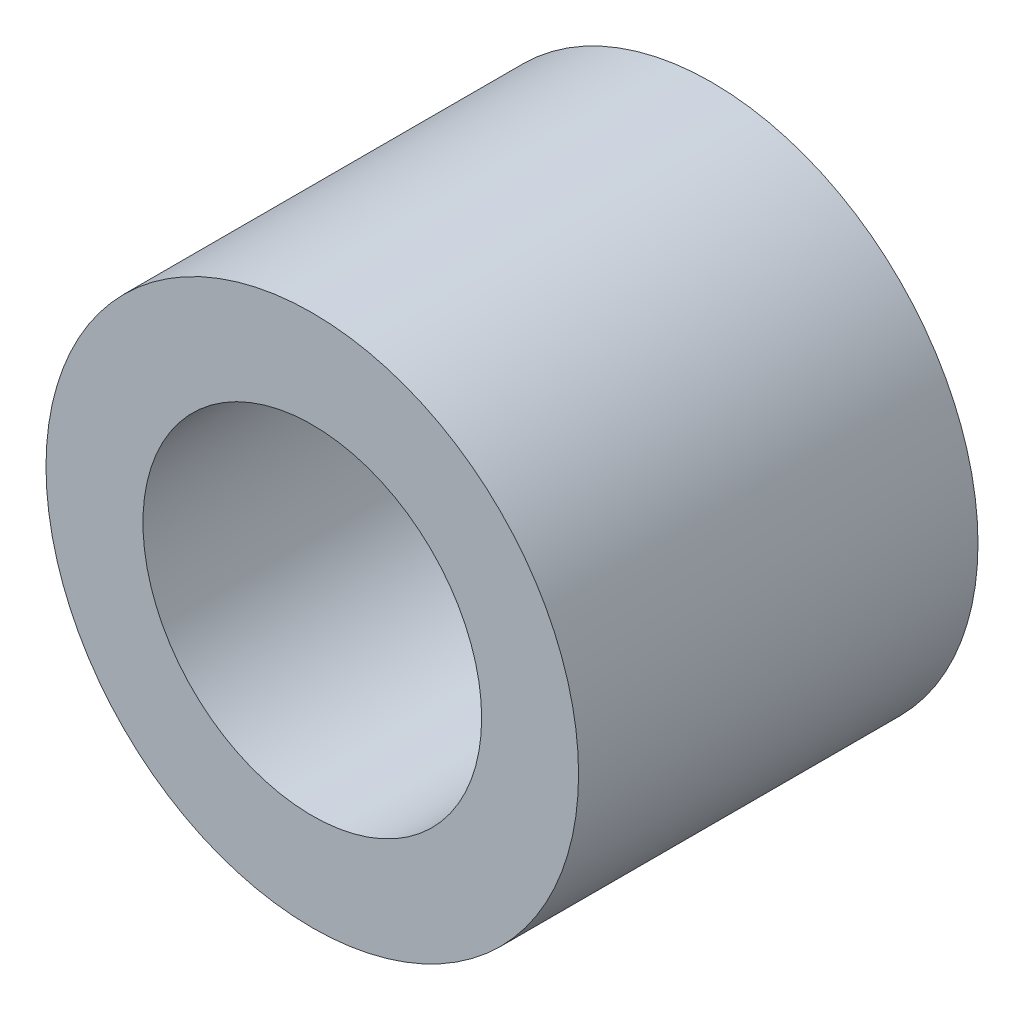
ISO-10303-21;
HEADER;
FILE_DESCRIPTION(('STEP AP214'),'2;1');
FILE_NAME('part.step','',(''),(''),'','','');
FILE_SCHEMA(('AUTOMOTIVE_DESIGN { 1 0 10303 214 1 1 1 1 }'));
ENDSEC;
DATA;
#1=APPLICATION_CONTEXT('core data for automotive mechanical design processes');
#2=APPLICATION_PROTOCOL_DEFINITION('international standard','automotive_design',2000,#1);
#3=PRODUCT_CONTEXT('',#1,'mechanical');
#4=PRODUCT('Part','Part','',(#3));
#5=PRODUCT_RELATED_PRODUCT_CATEGORY('part','',(#4));
#6=PRODUCT_DEFINITION_FORMATION('','',#4);
#7=PRODUCT_DEFINITION_CONTEXT('part definition',#1,'design');
#8=PRODUCT_DEFINITION('design','',#6,#7);
#9=PRODUCT_DEFINITION_SHAPE('','',#8);
#10=(LENGTH_UNIT() NAMED_UNIT(*) SI_UNIT(.MILLI.,.METRE.));
#11=(NAMED_UNIT(*) PLANE_ANGLE_UNIT() SI_UNIT($,.RADIAN.));
#12=(NAMED_UNIT(*) SI_UNIT($,.STERADIAN.) SOLID_ANGLE_UNIT());
#13=UNCERTAINTY_MEASURE_WITH_UNIT(LENGTH_MEASURE(1.E-05),#10,'distance_accuracy_value','');
#14=(GEOMETRIC_REPRESENTATION_CONTEXT(3) GLOBAL_UNCERTAINTY_ASSIGNED_CONTEXT((#13)) GLOBAL_UNIT_ASSIGNED_CONTEXT((#10,
#11,#12)) REPRESENTATION_CONTEXT('',''));
#15=CARTESIAN_POINT('',(0.,0.,0.));
#16=DIRECTION('',(0.,0.,1.));
#17=DIRECTION('',(1.,0.,0.));
#18=AXIS2_PLACEMENT_3D('',#15,#16,#17);
#19=CARTESIAN_POINT('',(0.,0.,37.5));
#20=DIRECTION('',(0.,0.,1.));
#21=DIRECTION('',(1.,0.,0.));
#22=AXIS2_PLACEMENT_3D('',#19,#20,#21);
#23=PLANE('',#22);
#24=CARTESIAN_POINT('',(0.,0.,37.5));
#25=DIRECTION('',(0.,0.,1.));
#26=DIRECTION('',(1.,0.,0.));
#27=AXIS2_PLACEMENT_3D('',#24,#25,#26);
#28=CIRCLE('',#27,25.);
#29=CARTESIAN_POINT('',(25.,0.,37.5));
#30=VERTEX_POINT('',#29);
#31=EDGE_CURVE('E10',#30,#30,#28,.T.);
#32=ORIENTED_EDGE('',*,*,#31,.T.);
#33=EDGE_LOOP('',(#32));
#34=FACE_BOUND('',#33,.T.);
#35=CARTESIAN_POINT('',(0.,0.,37.5));
#36=DIRECTION('',(0.,0.,1.));
#37=DIRECTION('',(1.,0.,0.));
#38=AXIS2_PLACEMENT_3D('',#35,#36,#37);
#39=CIRCLE('',#38,15.9);
#40=CARTESIAN_POINT('',(15.9,0.,37.5));
#41=VERTEX_POINT('',#40);
#42=EDGE_CURVE('E54',#41,#41,#39,.T.);
#43=ORIENTED_EDGE('',*,*,#42,.F.);
#44=EDGE_LOOP('',(#43));
#45=FACE_BOUND('',#44,.T.);
#46=ADVANCED_FACE('F43',(#34,#45),#23,.T.);
#47=CARTESIAN_POINT('',(0.,0.,0.));
#48=DIRECTION('',(0.,0.,1.));
#49=DIRECTION('',(1.,0.,0.));
#50=AXIS2_PLACEMENT_3D('',#47,#48,#49);
#51=PLANE('',#50);
#52=CARTESIAN_POINT('',(0.,0.,0.));
#53=DIRECTION('',(0.,0.,1.));
#54=DIRECTION('',(1.,0.,0.));
#55=AXIS2_PLACEMENT_3D('',#52,#53,#54);
#56=CIRCLE('',#55,25.);
#57=CARTESIAN_POINT('',(25.,0.,0.));
#58=VERTEX_POINT('',#57);
#59=EDGE_CURVE('E47',#58,#58,#56,.T.);
#60=ORIENTED_EDGE('',*,*,#59,.F.);
#61=EDGE_LOOP('',(#60));
#62=FACE_BOUND('',#61,.T.);
#63=CARTESIAN_POINT('',(0.,0.,0.));
#64=DIRECTION('',(0.,0.,1.));
#65=DIRECTION('',(1.,0.,0.));
#66=AXIS2_PLACEMENT_3D('',#63,#64,#65);
#67=CIRCLE('',#66,15.9);
#68=CARTESIAN_POINT('',(15.9,0.,0.));
#69=VERTEX_POINT('',#68);
#70=EDGE_CURVE('E56',#69,#69,#67,.T.);
#71=ORIENTED_EDGE('',*,*,#70,.T.);
#72=EDGE_LOOP('',(#71));
#73=FACE_BOUND('',#72,.T.);
#74=ADVANCED_FACE('F66',(#62,#73),#51,.F.);
#75=CARTESIAN_POINT('',(0.,0.,37.5));
#76=DIRECTION('',(0.,0.,-1.));
#77=DIRECTION('',(-1.,0.,0.));
#78=AXIS2_PLACEMENT_3D('',#75,#76,#77);
#79=CYLINDRICAL_SURFACE('',#78,25.);
#80=ORIENTED_EDGE('',*,*,#31,.F.);
#81=EDGE_LOOP('',(#80));
#82=FACE_BOUND('',#81,.T.);
#83=ORIENTED_EDGE('',*,*,#59,.T.);
#84=EDGE_LOOP('',(#83));
#85=FACE_BOUND('',#84,.T.);
#86=ADVANCED_FACE('F45',(#82,#85),#79,.T.);
#87=CARTESIAN_POINT('',(0.,0.,37.5));
#88=DIRECTION('',(0.,0.,-1.));
#89=DIRECTION('',(-1.,0.,0.));
#90=AXIS2_PLACEMENT_3D('',#87,#88,#89);
#91=CYLINDRICAL_SURFACE('',#90,15.9);
#92=ORIENTED_EDGE('',*,*,#42,.T.);
#93=EDGE_LOOP('',(#92));
#94=FACE_BOUND('',#93,.T.);
#95=ORIENTED_EDGE('',*,*,#70,.F.);
#96=EDGE_LOOP('',(#95));
#97=FACE_BOUND('',#96,.T.);
#98=ADVANCED_FACE('F62',(#94,#97),#91,.F.);
#99=CLOSED_SHELL('',(#46,#74,#86,#98));
#100=MANIFOLD_SOLID_BREP('B2',#99);
#101=ADVANCED_BREP_SHAPE_REPRESENTATION('',(#18,#100),#14);
#102=SHAPE_DEFINITION_REPRESENTATION(#9,#101);
ENDSEC;
END-ISO-10303-21;
